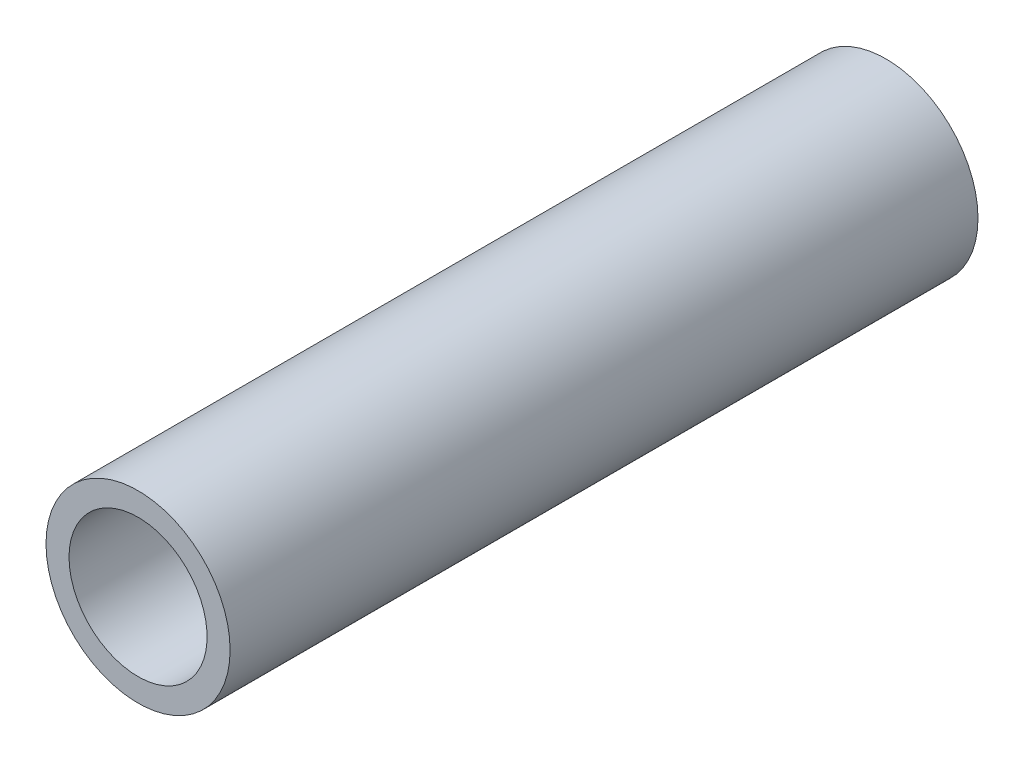
ISO-10303-21;
HEADER;
FILE_DESCRIPTION(('STEP AP214'),'2;1');
FILE_NAME('part.step','',(''),(''),'','','');
FILE_SCHEMA(('AUTOMOTIVE_DESIGN { 1 0 10303 214 1 1 1 1 }'));
ENDSEC;
DATA;
#1=APPLICATION_CONTEXT('core data for automotive mechanical design processes');
#2=APPLICATION_PROTOCOL_DEFINITION('international standard','automotive_design',2000,#1);
#3=PRODUCT_CONTEXT('',#1,'mechanical');
#4=PRODUCT('Part','Part','',(#3));
#5=PRODUCT_RELATED_PRODUCT_CATEGORY('part','',(#4));
#6=PRODUCT_DEFINITION_FORMATION('','',#4);
#7=PRODUCT_DEFINITION_CONTEXT('part definition',#1,'design');
#8=PRODUCT_DEFINITION('design','',#6,#7);
#9=PRODUCT_DEFINITION_SHAPE('','',#8);
#10=(LENGTH_UNIT() NAMED_UNIT(*) SI_UNIT(.MILLI.,.METRE.));
#11=(NAMED_UNIT(*) PLANE_ANGLE_UNIT() SI_UNIT($,.RADIAN.));
#12=(NAMED_UNIT(*) SI_UNIT($,.STERADIAN.) SOLID_ANGLE_UNIT());
#13=UNCERTAINTY_MEASURE_WITH_UNIT(LENGTH_MEASURE(1.E-05),#10,'distance_accuracy_value','');
#14=(GEOMETRIC_REPRESENTATION_CONTEXT(3) GLOBAL_UNCERTAINTY_ASSIGNED_CONTEXT((#13)) GLOBAL_UNIT_ASSIGNED_CONTEXT((#10,
#11,#12)) REPRESENTATION_CONTEXT('',''));
#15=CARTESIAN_POINT('',(0.,0.,0.));
#16=DIRECTION('',(0.,0.,1.));
#17=DIRECTION('',(1.,0.,0.));
#18=AXIS2_PLACEMENT_3D('',#15,#16,#17);
#19=CARTESIAN_POINT('',(180.,21.,32.));
#20=DIRECTION('',(0.,0.,-1.));
#21=DIRECTION('',(-1.,0.,0.));
#22=AXIS2_PLACEMENT_3D('',#19,#20,#21);
#23=PLANE('',#22);
#24=CARTESIAN_POINT('',(180.,21.,32.));
#25=DIRECTION('',(0.,0.,-1.));
#26=DIRECTION('',(-1.,0.,0.));
#27=AXIS2_PLACEMENT_3D('',#24,#25,#26);
#28=CIRCLE('',#27,3.);
#29=CARTESIAN_POINT('',(177.,21.,32.));
#30=VERTEX_POINT('',#29);
#31=EDGE_CURVE('E61',#30,#30,#28,.T.);
#32=ORIENTED_EDGE('',*,*,#31,.T.);
#33=EDGE_LOOP('',(#32));
#34=FACE_BOUND('',#33,.T.);
#35=CARTESIAN_POINT('',(180.,21.,32.));
#36=DIRECTION('',(0.,0.,-1.));
#37=DIRECTION('',(-1.,0.,0.));
#38=AXIS2_PLACEMENT_3D('',#35,#36,#37);
#39=CIRCLE('',#38,4.);
#40=CARTESIAN_POINT('',(176.,21.,32.));
#41=VERTEX_POINT('',#40);
#42=EDGE_CURVE('E51',#41,#41,#39,.T.);
#43=ORIENTED_EDGE('',*,*,#42,.F.);
#44=EDGE_LOOP('',(#43));
#45=FACE_BOUND('',#44,.T.);
#46=ADVANCED_FACE('F50',(#34,#45),#23,.F.);
#47=CARTESIAN_POINT('',(180.,21.,-0.5));
#48=DIRECTION('',(0.,0.,-1.));
#49=DIRECTION('',(-1.,0.,0.));
#50=AXIS2_PLACEMENT_3D('',#47,#48,#49);
#51=PLANE('',#50);
#52=CARTESIAN_POINT('',(180.,21.,-0.5));
#53=DIRECTION('',(0.,0.,-1.));
#54=DIRECTION('',(-1.,0.,0.));
#55=AXIS2_PLACEMENT_3D('',#52,#53,#54);
#56=CIRCLE('',#55,3.);
#57=CARTESIAN_POINT('',(177.,21.,-0.5));
#58=VERTEX_POINT('',#57);
#59=EDGE_CURVE('E59',#58,#58,#56,.T.);
#60=ORIENTED_EDGE('',*,*,#59,.F.);
#61=EDGE_LOOP('',(#60));
#62=FACE_BOUND('',#61,.T.);
#63=CARTESIAN_POINT('',(180.,21.,-0.5));
#64=DIRECTION('',(0.,0.,-1.));
#65=DIRECTION('',(-1.,0.,0.));
#66=AXIS2_PLACEMENT_3D('',#63,#64,#65);
#67=CIRCLE('',#66,4.);
#68=CARTESIAN_POINT('',(176.,21.,-0.5));
#69=VERTEX_POINT('',#68);
#70=EDGE_CURVE('E11',#69,#69,#67,.T.);
#71=ORIENTED_EDGE('',*,*,#70,.T.);
#72=EDGE_LOOP('',(#71));
#73=FACE_BOUND('',#72,.T.);
#74=ADVANCED_FACE('F73',(#62,#73),#51,.T.);
#75=CARTESIAN_POINT('',(180.,21.,32.));
#76=DIRECTION('',(0.,0.,-1.));
#77=DIRECTION('',(-1.,0.,0.));
#78=AXIS2_PLACEMENT_3D('',#75,#76,#77);
#79=CYLINDRICAL_SURFACE('',#78,4.);
#80=ORIENTED_EDGE('',*,*,#70,.F.);
#81=EDGE_LOOP('',(#80));
#82=FACE_BOUND('',#81,.T.);
#83=ORIENTED_EDGE('',*,*,#42,.T.);
#84=EDGE_LOOP('',(#83));
#85=FACE_BOUND('',#84,.T.);
#86=ADVANCED_FACE('F47',(#82,#85),#79,.T.);
#87=CARTESIAN_POINT('',(180.,21.,32.));
#88=DIRECTION('',(0.,0.,-1.));
#89=DIRECTION('',(-1.,0.,0.));
#90=AXIS2_PLACEMENT_3D('',#87,#88,#89);
#91=CYLINDRICAL_SURFACE('',#90,3.);
#92=ORIENTED_EDGE('',*,*,#59,.T.);
#93=EDGE_LOOP('',(#92));
#94=FACE_BOUND('',#93,.T.);
#95=ORIENTED_EDGE('',*,*,#31,.F.);
#96=EDGE_LOOP('',(#95));
#97=FACE_BOUND('',#96,.T.);
#98=ADVANCED_FACE('F67',(#94,#97),#91,.F.);
#99=CLOSED_SHELL('',(#46,#74,#86,#98));
#100=MANIFOLD_SOLID_BREP('B2',#99);
#101=ADVANCED_BREP_SHAPE_REPRESENTATION('',(#18,#100),#14);
#102=SHAPE_DEFINITION_REPRESENTATION(#9,#101);
ENDSEC;
END-ISO-10303-21;
